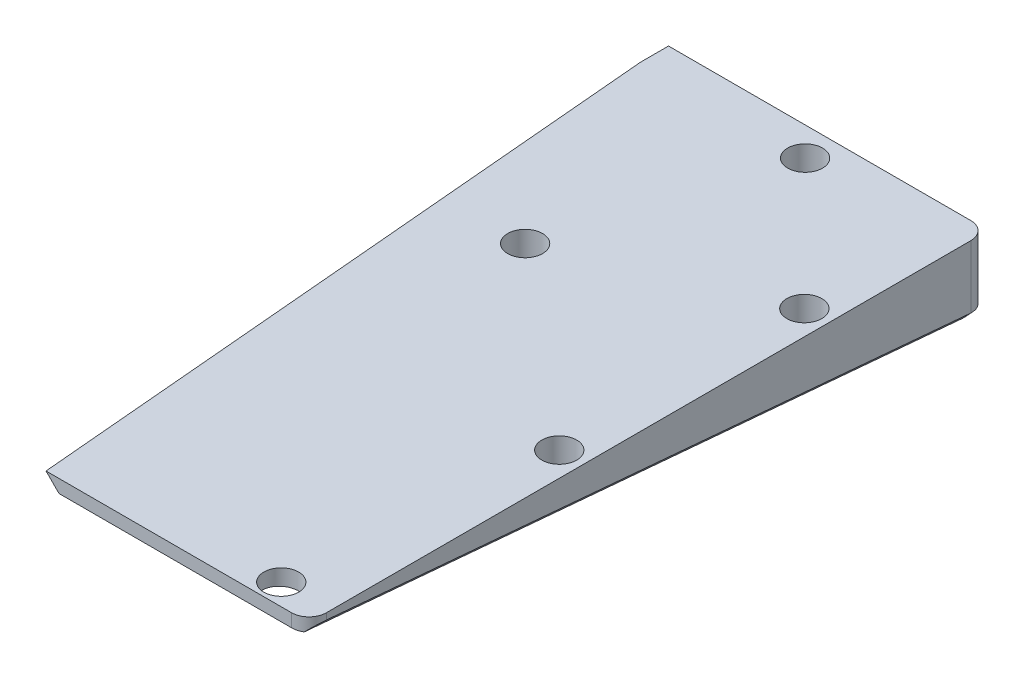
ISO-10303-21;
HEADER;
FILE_DESCRIPTION(('STEP AP214'),'2;1');
FILE_NAME('part.step','',(''),(''),'','','');
FILE_SCHEMA(('AUTOMOTIVE_DESIGN { 1 0 10303 214 1 1 1 1 }'));
ENDSEC;
DATA;
#1=APPLICATION_CONTEXT('core data for automotive mechanical design processes');
#2=APPLICATION_PROTOCOL_DEFINITION('international standard','automotive_design',2000,#1);
#3=PRODUCT_CONTEXT('',#1,'mechanical');
#4=PRODUCT('Part','Part','',(#3));
#5=PRODUCT_RELATED_PRODUCT_CATEGORY('part','',(#4));
#6=PRODUCT_DEFINITION_FORMATION('','',#4);
#7=PRODUCT_DEFINITION_CONTEXT('part definition',#1,'design');
#8=PRODUCT_DEFINITION('design','',#6,#7);
#9=PRODUCT_DEFINITION_SHAPE('','',#8);
#10=(LENGTH_UNIT() NAMED_UNIT(*) SI_UNIT(.MILLI.,.METRE.));
#11=(NAMED_UNIT(*) PLANE_ANGLE_UNIT() SI_UNIT($,.RADIAN.));
#12=(NAMED_UNIT(*) SI_UNIT($,.STERADIAN.) SOLID_ANGLE_UNIT());
#13=UNCERTAINTY_MEASURE_WITH_UNIT(LENGTH_MEASURE(1.E-05),#10,'distance_accuracy_value','');
#14=(GEOMETRIC_REPRESENTATION_CONTEXT(3) GLOBAL_UNCERTAINTY_ASSIGNED_CONTEXT((#13)) GLOBAL_UNIT_ASSIGNED_CONTEXT((#10,
#11,#12)) REPRESENTATION_CONTEXT('',''));
#15=CARTESIAN_POINT('',(0.,0.,0.));
#16=DIRECTION('',(0.,0.,1.));
#17=DIRECTION('',(1.,0.,0.));
#18=AXIS2_PLACEMENT_3D('',#15,#16,#17);
#19=CARTESIAN_POINT('',(0.,-17.7205902201383,1.55035075525034));
#20=DIRECTION('',(0.,-0.996194698091746,0.0871557427476512));
#21=DIRECTION('',(0.,-0.0871557427476512,-0.996194698091746));
#22=AXIS2_PLACEMENT_3D('',#19,#20,#21);
#23=PLANE('',#22);
#24=CARTESIAN_POINT('',(317.358422139956,-26.5355177914709,-99.2047324301417));
#25=DIRECTION('',(0.,-0.996194698091746,0.0871557427476512));
#26=DIRECTION('',(0.,0.0871557427476512,0.996194698091746));
#27=AXIS2_PLACEMENT_3D('',#24,#25,#26);
#28=ELLIPSE('',#27,3.01145951263003,2.99999999999999);
#29=CARTESIAN_POINT('',(317.358422139956,-26.2730518008931,-96.2047324301417));
#30=VERTEX_POINT('',#29);
#31=EDGE_CURVE('E284',#30,#30,#28,.T.);
#32=ORIENTED_EDGE('',*,*,#31,.F.);
#33=EDGE_LOOP('',(#32));
#34=FACE_BOUND('',#33,.T.);
#35=CARTESIAN_POINT('',(339.713934060173,-24.5681448630081,-76.7175569587733));
#36=DIRECTION('',(0.,-0.996194698091746,0.0871557427476512));
#37=DIRECTION('',(0.,0.0871557427476512,0.996194698091746));
#38=AXIS2_PLACEMENT_3D('',#35,#36,#37);
#39=ELLIPSE('',#38,3.01145951263003,2.99999999999999);
#40=CARTESIAN_POINT('',(342.588398945081,-24.4930139699997,-75.8588069221346));
#41=VERTEX_POINT('',#40);
#42=CARTESIAN_POINT('',(342.588398945081,-24.6432757560164,-77.576306995412));
#43=VERTEX_POINT('',#42);
#44=EDGE_CURVE('E59',#41,#43,#39,.T.);
#45=ORIENTED_EDGE('',*,*,#44,.F.);
#46=DIRECTION('',(0.,0.0871557427476512,0.996194698091746));
#47=VECTOR('',#46,1.);
#48=CARTESIAN_POINT('',(342.588398945081,-17.0078716172905,9.69676166295298));
#49=LINE('',#48,#47);
#50=CARTESIAN_POINT('',(342.588398945081,-20.9553185003777,-35.4227626731097));
#51=VERTEX_POINT('',#50);
#52=EDGE_CURVE('E129',#41,#51,#49,.T.);
#53=ORIENTED_EDGE('',*,*,#52,.T.);
#54=CARTESIAN_POINT('',(339.713934060173,-20.8801876073693,-34.564012636471));
#55=DIRECTION('',(0.,-0.996194698091746,0.0871557427476512));
#56=DIRECTION('',(0.,0.0871557427476512,0.996194698091746));
#57=AXIS2_PLACEMENT_3D('',#54,#55,#56);
#58=ELLIPSE('',#57,3.01145951263003,2.99999999999999);
#59=CARTESIAN_POINT('',(342.588398945081,-20.805056714361,-33.7052625998323));
#60=VERTEX_POINT('',#59);
#61=EDGE_CURVE('E53',#60,#51,#58,.T.);
#62=ORIENTED_EDGE('',*,*,#61,.F.);
#63=CARTESIAN_POINT('',(342.588398945081,-16.7900939448977,12.1859718487765));
#64=VERTEX_POINT('',#63);
#65=EDGE_CURVE('E127',#60,#64,#49,.T.);
#66=ORIENTED_EDGE('',*,*,#65,.T.);
#67=CARTESIAN_POINT('',(340.913934060172,-17.0078716172905,9.69676166295297));
#68=DIRECTION('',(0.,-0.996194698091746,0.0871557427476512));
#69=DIRECTION('',(0.,-0.0871557427476512,-0.996194698091746));
#70=AXIS2_PLACEMENT_3D('',#67,#68,#69);
#71=ELLIPSE('',#70,3.01145951263004,3.);
#72=CARTESIAN_POINT('',(340.913934060172,-16.7454056267128,12.696761662953));
#73=VERTEX_POINT('',#72);
#74=EDGE_CURVE('E164',#64,#73,#71,.T.);
#75=ORIENTED_EDGE('',*,*,#74,.T.);
#76=DIRECTION('',(1.,0.,0.));
#77=VECTOR('',#76,1.);
#78=CARTESIAN_POINT('',(288.913934060172,-16.7454056267128,12.6967616629529));
#79=LINE('',#78,#77);
#80=CARTESIAN_POINT('',(300.913934060173,-16.7454056267128,12.6967616629529));
#81=VERTEX_POINT('',#80);
#82=EDGE_CURVE('E300',#81,#73,#79,.T.);
#83=ORIENTED_EDGE('',*,*,#82,.F.);
#84=DIRECTION('',(0.,-0.0871557427476512,-0.996194698091746));
#85=VECTOR('',#84,1.);
#86=CARTESIAN_POINT('',(300.913934060173,-17.7205902201383,1.55035075525034));
#87=LINE('',#86,#85);
#88=CARTESIAN_POINT('',(300.913934060173,-26.8418550294905,-102.70618308299));
#89=VERTEX_POINT('',#88);
#90=EDGE_CURVE('E333',#81,#89,#87,.T.);
#91=ORIENTED_EDGE('',*,*,#90,.T.);
#92=DIRECTION('',(1.,0.,0.));
#93=VECTOR('',#92,1.);
#94=CARTESIAN_POINT('',(340.913934060172,-26.8418550294905,-102.70618308299));
#95=LINE('',#94,#93);
#96=CARTESIAN_POINT('',(340.913934060173,-26.8418550294905,-102.70618308299));
#97=VERTEX_POINT('',#96);
#98=EDGE_CURVE('E136',#89,#97,#95,.T.);
#99=ORIENTED_EDGE('',*,*,#98,.T.);
#100=CARTESIAN_POINT('',(342.588398945081,-26.6953583345888,-101.031718198081));
#101=CARTESIAN_POINT('',(342.588406328742,-26.7049465744389,-101.141312281059));
#102=CARTESIAN_POINT('',(342.577605316831,-26.7145344174403,-101.250901828036));
#103=CARTESIAN_POINT('',(342.534843826856,-26.7333424265026,-101.465878355329));
#104=CARTESIAN_POINT('',(342.502877735184,-26.7425618140536,-101.571256437236));
#105=CARTESIAN_POINT('',(342.418998055313,-26.7602785711942,-101.773759897989));
#106=CARTESIAN_POINT('',(342.367087939197,-26.7687752074231,-101.870876894482));
#107=CARTESIAN_POINT('',(342.245313518486,-26.7847198676008,-102.053125194264));
#108=CARTESIAN_POINT('',(342.175454254578,-26.7921672315422,-102.138248953631));
#109=CARTESIAN_POINT('',(342.020464815723,-26.8057270504082,-102.293238392486));
#110=CARTESIAN_POINT('',(341.935341056356,-26.8118389440424,-102.363097656394));
#111=CARTESIAN_POINT('',(341.753092756573,-26.8224928253622,-102.484872077107));
#112=CARTESIAN_POINT('',(341.655975760083,-26.8270343720445,-102.53678219322));
#113=CARTESIAN_POINT('',(341.453472299325,-26.8343728931336,-102.620661873094));
#114=CARTESIAN_POINT('',(341.348094217424,-26.8371695637719,-102.652627964763));
#115=CARTESIAN_POINT('',(341.133117690124,-26.8409107093803,-102.69538945474));
#116=CARTESIAN_POINT('',(341.023528143151,-26.8418556754771,-102.706190466651));
#117=CARTESIAN_POINT('',(340.913934060173,-26.8418550294905,-102.70618308299));
#118=B_SPLINE_CURVE_WITH_KNOTS('',3,(#100,#101,#102,#103,#104,#105,#106,#107,#108,#109,#110,
#111,#112,#113,#114,#115,#116,#117),.UNSPECIFIED.,.F.,.F.,(4,2,2,2,2,2,2,2,4),(3.14159265358979,
3.33794219443916,3.53429173528852,3.73064127613788,3.92699081698724,4.1233403578366,
4.31968989868597,4.51603943953533,4.71238898038469),.UNSPECIFIED.);
#119=CARTESIAN_POINT('',(342.588398945081,-26.6953583345888,-101.031718198081));
#120=VERTEX_POINT('',#119);
#121=EDGE_CURVE('E140',#97,#120,#118,.F.);
#122=ORIENTED_EDGE('',*,*,#121,.T.);
#123=EDGE_CURVE('E138',#120,#43,#49,.T.);
#124=ORIENTED_EDGE('',*,*,#123,.T.);
#125=EDGE_LOOP('',(#45,#53,#62,#66,#75,#83,#91,#99,#122,#124));
#126=FACE_BOUND('',#125,.T.);
#127=CARTESIAN_POINT('',(335.469137880215,-17.0672587749561,9.01796334472294));
#128=DIRECTION('',(0.,-0.996194698091746,0.0871557427476512));
#129=DIRECTION('',(0.,0.0871557427476512,0.996194698091746));
#130=AXIS2_PLACEMENT_3D('',#127,#128,#129);
#131=ELLIPSE('',#130,3.01145951263003,2.99999999999999);
#132=CARTESIAN_POINT('',(335.469137880215,-16.8047927843783,12.0179633447229));
#133=VERTEX_POINT('',#132);
#134=EDGE_CURVE('E287',#133,#133,#131,.T.);
#135=ORIENTED_EDGE('',*,*,#134,.F.);
#136=EDGE_LOOP('',(#135));
#137=FACE_BOUND('',#136,.T.);
#138=CARTESIAN_POINT('',(306.008403345819,-23.3147147139886,-62.3907847976222));
#139=DIRECTION('',(0.,-0.996194698091746,0.0871557427476512));
#140=DIRECTION('',(0.,0.0871557427476512,0.996194698091746));
#141=AXIS2_PLACEMENT_3D('',#138,#139,#140);
#142=ELLIPSE('',#141,3.01145951263003,2.99999999999999);
#143=CARTESIAN_POINT('',(306.008403345819,-23.0522487234109,-59.3907847976222));
#144=VERTEX_POINT('',#143);
#145=EDGE_CURVE('E292',#144,#144,#142,.T.);
#146=ORIENTED_EDGE('',*,*,#145,.F.);
#147=EDGE_LOOP('',(#146));
#148=FACE_BOUND('',#147,.T.);
#149=ADVANCED_FACE('F37',(#34,#126,#137,#148),#23,.T.);
#150=CARTESIAN_POINT('',(0.,-14.5,0.));
#151=DIRECTION('',(0.,-1.,0.));
#152=DIRECTION('',(0.,0.,-1.));
#153=AXIS2_PLACEMENT_3D('',#150,#151,#152);
#154=PLANE('',#153);
#155=CARTESIAN_POINT('',(317.358422139956,-14.5,-99.2047324301417));
#156=DIRECTION('',(0.,1.,0.));
#157=DIRECTION('',(0.,0.,1.));
#158=AXIS2_PLACEMENT_3D('',#155,#156,#157);
#159=CIRCLE('',#158,2.99999999999999);
#160=CARTESIAN_POINT('',(317.358422139956,-14.5,-96.2047324301417));
#161=VERTEX_POINT('',#160);
#162=EDGE_CURVE('E130',#161,#161,#159,.T.);
#163=ORIENTED_EDGE('',*,*,#162,.F.);
#164=EDGE_LOOP('',(#163));
#165=FACE_BOUND('',#164,.T.);
#166=CARTESIAN_POINT('',(339.713934060173,-14.5,-76.7175569587733));
#167=DIRECTION('',(0.,1.,0.));
#168=DIRECTION('',(0.,0.,1.));
#169=AXIS2_PLACEMENT_3D('',#166,#167,#168);
#170=CIRCLE('',#169,2.99999999999999);
#171=CARTESIAN_POINT('',(339.713934060173,-14.5,-73.7175569587733));
#172=VERTEX_POINT('',#171);
#173=EDGE_CURVE('E387',#172,#172,#170,.T.);
#174=ORIENTED_EDGE('',*,*,#173,.F.);
#175=EDGE_LOOP('',(#174));
#176=FACE_BOUND('',#175,.T.);
#177=CARTESIAN_POINT('',(339.713934060173,-14.5,-34.564012636471));
#178=DIRECTION('',(0.,1.,0.));
#179=DIRECTION('',(0.,0.,1.));
#180=AXIS2_PLACEMENT_3D('',#177,#178,#179);
#181=CIRCLE('',#180,2.99999999999999);
#182=CARTESIAN_POINT('',(339.713934060173,-14.5,-31.564012636471));
#183=VERTEX_POINT('',#182);
#184=EDGE_CURVE('E390',#183,#183,#181,.T.);
#185=ORIENTED_EDGE('',*,*,#184,.F.);
#186=EDGE_LOOP('',(#185));
#187=FACE_BOUND('',#186,.T.);
#188=CARTESIAN_POINT('',(335.469137880215,-14.5,9.01796334472294));
#189=DIRECTION('',(0.,1.,0.));
#190=DIRECTION('',(0.,0.,1.));
#191=AXIS2_PLACEMENT_3D('',#188,#189,#190);
#192=CIRCLE('',#191,2.99999999999999);
#193=CARTESIAN_POINT('',(335.469137880215,-14.5,12.0179633447229));
#194=VERTEX_POINT('',#193);
#195=EDGE_CURVE('E395',#194,#194,#192,.T.);
#196=ORIENTED_EDGE('',*,*,#195,.F.);
#197=EDGE_LOOP('',(#196));
#198=FACE_BOUND('',#197,.T.);
#199=CARTESIAN_POINT('',(306.008403345819,-14.5,-62.3907847976222));
#200=DIRECTION('',(0.,1.,0.));
#201=DIRECTION('',(0.,0.,1.));
#202=AXIS2_PLACEMENT_3D('',#199,#200,#201);
#203=CIRCLE('',#202,2.99999999999999);
#204=CARTESIAN_POINT('',(306.008403345819,-14.5,-59.3907847976222));
#205=VERTEX_POINT('',#204);
#206=EDGE_CURVE('E398',#205,#205,#203,.T.);
#207=ORIENTED_EDGE('',*,*,#206,.F.);
#208=EDGE_LOOP('',(#207));
#209=FACE_BOUND('',#208,.T.);
#210=DIRECTION('',(0.,0.,1.));
#211=VECTOR('',#210,1.);
#212=CARTESIAN_POINT('',(288.913934060172,-14.5,-104.155083501279));
#213=LINE('',#212,#211);
#214=CARTESIAN_POINT('',(288.913934060172,-14.5,-104.155083501279));
#215=VERTEX_POINT('',#214);
#216=CARTESIAN_POINT('',(288.913934060172,-14.5,-99.3226935308554));
#217=VERTEX_POINT('',#216);
#218=EDGE_CURVE('E285',#215,#217,#213,.T.);
#219=ORIENTED_EDGE('',*,*,#218,.T.);
#220=DIRECTION('',(-0.0868265938642397,0.,-0.996223440096615));
#221=VECTOR('',#220,1.);
#222=CARTESIAN_POINT('',(287.472081219976,-14.5,-115.866099561721));
#223=LINE('',#222,#221);
#224=CARTESIAN_POINT('',(298.677072879776,-14.5,12.6967616629529));
#225=VERTEX_POINT('',#224);
#226=EDGE_CURVE('E334',#217,#225,#223,.F.);
#227=ORIENTED_EDGE('',*,*,#226,.T.);
#228=DIRECTION('',(1.,0.,0.));
#229=VECTOR('',#228,1.);
#230=CARTESIAN_POINT('',(288.913934060172,-14.5,12.6967616629529));
#231=LINE('',#230,#229);
#232=CARTESIAN_POINT('',(340.913934060172,-14.5,12.696761662953));
#233=VERTEX_POINT('',#232);
#234=EDGE_CURVE('E298',#225,#233,#231,.T.);
#235=ORIENTED_EDGE('',*,*,#234,.T.);
#236=CARTESIAN_POINT('',(340.913934060172,-14.5,9.69676166295297));
#237=DIRECTION('',(0.,-1.,0.));
#238=DIRECTION('',(0.,0.,-1.));
#239=AXIS2_PLACEMENT_3D('',#236,#237,#238);
#240=CIRCLE('',#239,3.);
#241=CARTESIAN_POINT('',(343.913934060172,-14.5,9.69676166295297));
#242=VERTEX_POINT('',#241);
#243=EDGE_CURVE('E156',#233,#242,#240,.F.);
#244=ORIENTED_EDGE('',*,*,#243,.T.);
#245=DIRECTION('',(0.,0.,1.));
#246=VECTOR('',#245,1.);
#247=CARTESIAN_POINT('',(343.913934060172,-14.5,-104.155083501279));
#248=LINE('',#247,#246);
#249=CARTESIAN_POINT('',(343.913934060172,-14.5,-101.155083501279));
#250=VERTEX_POINT('',#249);
#251=EDGE_CURVE('E301',#250,#242,#248,.T.);
#252=ORIENTED_EDGE('',*,*,#251,.F.);
#253=CARTESIAN_POINT('',(340.913934060172,-14.5,-101.155083501279));
#254=DIRECTION('',(0.,-1.,0.));
#255=DIRECTION('',(0.,0.,-1.));
#256=AXIS2_PLACEMENT_3D('',#253,#254,#255);
#257=CIRCLE('',#256,3.);
#258=CARTESIAN_POINT('',(340.913934060172,-14.5,-104.155083501279));
#259=VERTEX_POINT('',#258);
#260=EDGE_CURVE('E313',#250,#259,#257,.F.);
#261=ORIENTED_EDGE('',*,*,#260,.T.);
#262=DIRECTION('',(1.,0.,0.));
#263=VECTOR('',#262,1.);
#264=CARTESIAN_POINT('',(288.913934060172,-14.5,-104.155083501279));
#265=LINE('',#264,#263);
#266=EDGE_CURVE('E305',#215,#259,#265,.T.);
#267=ORIENTED_EDGE('',*,*,#266,.F.);
#268=EDGE_LOOP('',(#219,#227,#235,#244,#252,#261,#267));
#269=FACE_BOUND('',#268,.T.);
#270=ADVANCED_FACE('F319',(#165,#176,#187,#198,#209,#269),#154,.F.);
#271=CARTESIAN_POINT('',(288.913934060172,-151.252247056961,-104.155083501279));
#272=DIRECTION('',(-1.,0.,0.));
#273=DIRECTION('',(0.,0.,1.));
#274=AXIS2_PLACEMENT_3D('',#271,#272,#273);
#275=PLANE('',#274);
#276=DIRECTION('',(0.,1.,0.));
#277=VECTOR('',#276,1.);
#278=CARTESIAN_POINT('',(288.913934060172,-151.252247056961,-104.155083501279));
#279=LINE('',#278,#277);
#280=CARTESIAN_POINT('',(288.913934060172,-14.9227793401484,-104.155083501279));
#281=VERTEX_POINT('',#280);
#282=EDGE_CURVE('E304',#281,#215,#279,.T.);
#283=ORIENTED_EDGE('',*,*,#282,.F.);
#284=DIRECTION('',(0.,0.0871557427476512,0.996194698091746));
#285=VECTOR('',#284,1.);
#286=CARTESIAN_POINT('',(288.913934060172,-15.9583548127822,-115.991765316942));
#287=LINE('',#286,#285);
#288=EDGE_CURVE('E169',#281,#217,#287,.T.);
#289=ORIENTED_EDGE('',*,*,#288,.T.);
#290=ORIENTED_EDGE('',*,*,#218,.F.);
#291=EDGE_LOOP('',(#283,#289,#290));
#292=FACE_BOUND('',#291,.T.);
#293=ADVANCED_FACE('F352',(#292),#275,.T.);
#294=CARTESIAN_POINT('',(288.913934060172,-151.252247056961,12.6967616629529));
#295=DIRECTION('',(0.,0.,1.));
#296=DIRECTION('',(1.,0.,0.));
#297=AXIS2_PLACEMENT_3D('',#294,#295,#296);
#298=PLANE('',#297);
#299=ORIENTED_EDGE('',*,*,#234,.F.);
#300=DIRECTION('',(-0.705757556807948,0.708453436019952,0.));
#301=VECTOR('',#300,1.);
#302=CARTESIAN_POINT('',(362.18974124536,-78.2552764406855,12.696761662953));
#303=LINE('',#302,#301);
#304=EDGE_CURVE('E332',#225,#81,#303,.F.);
#305=ORIENTED_EDGE('',*,*,#304,.T.);
#306=ORIENTED_EDGE('',*,*,#82,.T.);
#307=DIRECTION('',(0.,1.,0.));
#308=VECTOR('',#307,1.);
#309=CARTESIAN_POINT('',(340.913934060172,-14.5,12.696761662953));
#310=LINE('',#309,#308);
#311=EDGE_CURVE('E308',#73,#233,#310,.T.);
#312=ORIENTED_EDGE('',*,*,#311,.T.);
#313=EDGE_LOOP('',(#299,#305,#306,#312));
#314=FACE_BOUND('',#313,.T.);
#315=ADVANCED_FACE('F330',(#314),#298,.T.);
#316=CARTESIAN_POINT('',(343.913934060172,-151.252247056961,-104.155083501279));
#317=DIRECTION('',(-1.,0.,0.));
#318=DIRECTION('',(0.,0.,1.));
#319=AXIS2_PLACEMENT_3D('',#316,#317,#318);
#320=PLANE('',#319);
#321=DIRECTION('',(0.,1.,0.));
#322=VECTOR('',#321,1.);
#323=CARTESIAN_POINT('',(343.913934060172,-16.7454056267128,9.69676166295297));
#324=LINE('',#323,#322);
#325=CARTESIAN_POINT('',(343.913934060172,-15.5870066838904,9.69676166295297));
#326=VERTEX_POINT('',#325);
#327=EDGE_CURVE('E155',#242,#326,#324,.F.);
#328=ORIENTED_EDGE('',*,*,#327,.T.);
#329=DIRECTION('',(0.,-0.0871557427476512,-0.996194698091746));
#330=VECTOR('',#329,1.);
#331=CARTESIAN_POINT('',(343.913934060172,-25.2960795321932,-101.278448804477));
#332=LINE('',#331,#330);
#333=CARTESIAN_POINT('',(343.913934060172,-25.2852864666909,-101.155083501279));
#334=VERTEX_POINT('',#333);
#335=EDGE_CURVE('E151',#326,#334,#332,.T.);
#336=ORIENTED_EDGE('',*,*,#335,.T.);
#337=DIRECTION('',(0.,1.,0.));
#338=VECTOR('',#337,1.);
#339=CARTESIAN_POINT('',(343.913934060172,-151.252247056961,-101.155083501279));
#340=LINE('',#339,#338);
#341=EDGE_CURVE('E152',#334,#250,#340,.T.);
#342=ORIENTED_EDGE('',*,*,#341,.T.);
#343=ORIENTED_EDGE('',*,*,#251,.T.);
#344=EDGE_LOOP('',(#328,#336,#342,#343));
#345=FACE_BOUND('',#344,.T.);
#346=ADVANCED_FACE('F325',(#345),#320,.F.);
#347=CARTESIAN_POINT('',(288.913934060172,-151.252247056961,-104.155083501279));
#348=DIRECTION('',(0.,0.,1.));
#349=DIRECTION('',(1.,0.,0.));
#350=AXIS2_PLACEMENT_3D('',#347,#348,#349);
#351=PLANE('',#350);
#352=DIRECTION('',(0.,1.,0.));
#353=VECTOR('',#352,1.);
#354=CARTESIAN_POINT('',(340.913934060172,-151.252247056961,-104.155083501279));
#355=LINE('',#354,#353);
#356=CARTESIAN_POINT('',(340.913934060172,-25.4317831615908,-104.155083501279));
#357=VERTEX_POINT('',#356);
#358=EDGE_CURVE('E166',#259,#357,#355,.F.);
#359=ORIENTED_EDGE('',*,*,#358,.T.);
#360=DIRECTION('',(-1.,0.,0.));
#361=VECTOR('',#360,1.);
#362=CARTESIAN_POINT('',(300.913934060173,-25.4317831615926,-104.155083501279));
#363=LINE('',#362,#361);
#364=CARTESIAN_POINT('',(299.382947949321,-25.4317831615926,-104.155083501279));
#365=VERTEX_POINT('',#364);
#366=EDGE_CURVE('E175',#357,#365,#363,.T.);
#367=ORIENTED_EDGE('',*,*,#366,.T.);
#368=DIRECTION('',(0.705757556807948,-0.708453436019952,0.));
#369=VECTOR('',#368,1.);
#370=CARTESIAN_POINT('',(289.43171803333,-15.4425411639659,-104.155083501279));
#371=LINE('',#370,#369);
#372=EDGE_CURVE('E336',#365,#281,#371,.F.);
#373=ORIENTED_EDGE('',*,*,#372,.T.);
#374=ORIENTED_EDGE('',*,*,#282,.T.);
#375=ORIENTED_EDGE('',*,*,#266,.T.);
#376=EDGE_LOOP('',(#359,#367,#373,#374,#375));
#377=FACE_BOUND('',#376,.T.);
#378=ADVANCED_FACE('F360',(#377),#351,.F.);
#379=CARTESIAN_POINT('',(340.913934060172,-151.252247056961,9.69676166295297));
#380=DIRECTION('',(0.,-1.,0.));
#381=DIRECTION('',(0.,0.,-1.));
#382=AXIS2_PLACEMENT_3D('',#379,#380,#381);
#383=CYLINDRICAL_SURFACE('',#382,3.);
#384=ORIENTED_EDGE('',*,*,#74,.F.);
#385=CARTESIAN_POINT('',(340.913934060172,-18.802760647456,9.69676166295297));
#386=DIRECTION('',(0.729911946088875,-0.680940103962023,0.0595745396368363));
#387=DIRECTION('',(-0.678683288080086,-0.732339111898436,-0.0553933178696906));
#388=AXIS2_PLACEMENT_3D('',#385,#386,#387);
#389=ELLIPSE('',#388,4.40567383613422,3.);
#390=EDGE_CURVE('E134',#64,#326,#389,.F.);
#391=ORIENTED_EDGE('',*,*,#390,.T.);
#392=ORIENTED_EDGE('',*,*,#327,.F.);
#393=ORIENTED_EDGE('',*,*,#243,.F.);
#394=ORIENTED_EDGE('',*,*,#311,.F.);
#395=EDGE_LOOP('',(#384,#391,#392,#393,#394));
#396=FACE_BOUND('',#395,.T.);
#397=ADVANCED_FACE('F203',(#396),#383,.T.);
#398=CARTESIAN_POINT('',(340.913934060172,-151.252247056961,-101.155083501279));
#399=DIRECTION('',(0.,1.,0.));
#400=DIRECTION('',(0.,0.,1.));
#401=AXIS2_PLACEMENT_3D('',#398,#399,#400);
#402=CYLINDRICAL_SURFACE('',#401,3.);
#403=ORIENTED_EDGE('',*,*,#341,.F.);
#404=CARTESIAN_POINT('',(340.913934060172,-25.4317831615926,-104.155083501279));
#405=CARTESIAN_POINT('',(341.110284698455,-25.4317838075793,-104.155096729973));
#406=CARTESIAN_POINT('',(341.306627209957,-25.4308388414824,-104.135745451826));
#407=CARTESIAN_POINT('',(341.691782842485,-25.427097695874,-104.059133233151));
#408=CARTESIAN_POINT('',(341.88058002095,-25.4243010252357,-104.001862235189));
#409=CARTESIAN_POINT('',(342.243388693585,-25.4169625041466,-103.851581962437));
#410=CARTESIAN_POINT('',(342.417385169772,-25.4124209574643,-103.758578908299));
#411=CARTESIAN_POINT('',(342.743904348691,-25.4017670761446,-103.540405768074));
#412=CARTESIAN_POINT('',(342.896413535597,-25.3956551825104,-103.415244712974));
#413=CARTESIAN_POINT('',(343.174095271867,-25.3820953636443,-103.137562976703));
#414=CARTESIAN_POINT('',(343.299256326968,-25.374647999703,-102.985053789796));
#415=CARTESIAN_POINT('',(343.517429467192,-25.3587033395251,-102.658534610879));
#416=CARTESIAN_POINT('',(343.610432521331,-25.3502067032964,-102.48453813469));
#417=CARTESIAN_POINT('',(343.760712794082,-25.3324899461556,-102.121729462058));
#418=CARTESIAN_POINT('',(343.817983792045,-25.3232705586048,-101.932932283589));
#419=CARTESIAN_POINT('',(343.89459601072,-25.3044625495423,-101.547776651065));
#420=CARTESIAN_POINT('',(343.913947288866,-25.294874706541,-101.351434139562));
#421=CARTESIAN_POINT('',(343.913934060172,-25.2852864666909,-101.155083501279));
#422=B_SPLINE_CURVE_WITH_KNOTS('',3,(#404,#405,#406,#407,#408,#409,#410,#411,#412,#413,#414,
#415,#416,#417,#418,#419,#420,#421),.UNSPECIFIED.,.F.,.F.,(4,2,2,2,2,2,2,2,4),(3.14159265358979,
3.33794219443916,3.53429173528852,3.73064127613788,3.92699081698724,4.1233403578366,
4.31968989868597,4.51603943953533,4.71238898038469),.UNSPECIFIED.);
#423=EDGE_CURVE('E124',#334,#357,#422,.F.);
#424=ORIENTED_EDGE('',*,*,#423,.T.);
#425=ORIENTED_EDGE('',*,*,#358,.F.);
#426=ORIENTED_EDGE('',*,*,#260,.F.);
#427=EDGE_LOOP('',(#403,#424,#425,#426));
#428=FACE_BOUND('',#427,.T.);
#429=ADVANCED_FACE('F192',(#428),#402,.T.);
#430=CARTESIAN_POINT('',(288.913934060172,-15.9583548127822,-115.991765316942));
#431=DIRECTION('',(0.707106781186551,0.704416026402755,-0.0616284167162141));
#432=DIRECTION('',(0.,0.0871557427476512,0.996194698091746));
#433=AXIS2_PLACEMENT_3D('',#430,#431,#432);
#434=PLANE('',#433);
#435=ORIENTED_EDGE('',*,*,#372,.F.);
#436=DIRECTION('',(-0.603689998028265,0.556011760732112,-0.571322420536959));
#437=VECTOR('',#436,1.);
#438=CARTESIAN_POINT('',(288.305273759412,-15.2290016822484,-114.638814642709));
#439=LINE('',#438,#437);
#440=EDGE_CURVE('E177',#365,#89,#439,.F.);
#441=ORIENTED_EDGE('',*,*,#440,.T.);
#442=ORIENTED_EDGE('',*,*,#90,.F.);
#443=ORIENTED_EDGE('',*,*,#304,.F.);
#444=ORIENTED_EDGE('',*,*,#226,.F.);
#445=ORIENTED_EDGE('',*,*,#288,.F.);
#446=EDGE_LOOP('',(#435,#441,#442,#443,#444,#445));
#447=FACE_BOUND('',#446,.T.);
#448=ADVANCED_FACE('F202',(#447),#434,.F.);
#449=CARTESIAN_POINT('',(0.,-26.8418550294905,-102.70618308299));
#450=DIRECTION('',(0.,-0.716644118025435,-0.697439035399902));
#451=DIRECTION('',(-1.,0.,0.));
#452=AXIS2_PLACEMENT_3D('',#449,#450,#451);
#453=PLANE('',#452);
#454=ORIENTED_EDGE('',*,*,#440,.F.);
#455=ORIENTED_EDGE('',*,*,#366,.F.);
#456=CARTESIAN_POINT('',(340.913934060173,-26.8418550294905,-102.70618308299));
#457=CARTESIAN_POINT('',(340.913934060172,-25.4317831615926,-104.155083501279));
#458=B_SPLINE_CURVE_WITH_KNOTS('',1,(#456,#457),.UNSPECIFIED.,.F.,.F.,(2,2),(0.,1.),.UNSPECIFIED.);
#459=EDGE_CURVE('E255',#97,#357,#458,.T.);
#460=ORIENTED_EDGE('',*,*,#459,.F.);
#461=ORIENTED_EDGE('',*,*,#98,.F.);
#462=EDGE_LOOP('',(#454,#455,#460,#461));
#463=FACE_BOUND('',#462,.T.);
#464=ADVANCED_FACE('F40',(#463),#453,.T.);
#465=CARTESIAN_POINT('',(340.913934060173,-26.8418550294905,-102.70618308299));
#466=CARTESIAN_POINT('',(341.023528143151,-26.8418556754771,-102.706190466651));
#467=CARTESIAN_POINT('',(341.133117690124,-26.8409107093803,-102.69538945474));
#468=CARTESIAN_POINT('',(341.348094217424,-26.8371695637719,-102.652627964763));
#469=CARTESIAN_POINT('',(341.453472299325,-26.8343728931336,-102.620661873094));
#470=CARTESIAN_POINT('',(341.655975760083,-26.8270343720445,-102.53678219322));
#471=CARTESIAN_POINT('',(341.753092756573,-26.8224928253622,-102.484872077107));
#472=CARTESIAN_POINT('',(341.935341056356,-26.8118389440424,-102.363097656394));
#473=CARTESIAN_POINT('',(342.020464815723,-26.8057270504082,-102.293238392486));
#474=CARTESIAN_POINT('',(342.175454254578,-26.7921672315422,-102.138248953631));
#475=CARTESIAN_POINT('',(342.245313518486,-26.7847198676008,-102.053125194264));
#476=CARTESIAN_POINT('',(342.367087939197,-26.7687752074231,-101.870876894482));
#477=CARTESIAN_POINT('',(342.418998055313,-26.7602785711942,-101.773759897989));
#478=CARTESIAN_POINT('',(342.502877735184,-26.7425618140536,-101.571256437236));
#479=CARTESIAN_POINT('',(342.534843826856,-26.7333424265026,-101.465878355329));
#480=CARTESIAN_POINT('',(342.577605316831,-26.7145344174403,-101.250901828036));
#481=CARTESIAN_POINT('',(342.588406328742,-26.7049465744389,-101.141312281059));
#482=CARTESIAN_POINT('',(342.588398945081,-26.6953583345888,-101.031718198081));
#483=CARTESIAN_POINT('',(340.913934060172,-25.4317831615926,-104.155083501279));
#484=CARTESIAN_POINT('',(341.110284698455,-25.4317838075793,-104.155096729973));
#485=CARTESIAN_POINT('',(341.306627209957,-25.4308388414824,-104.135745451826));
#486=CARTESIAN_POINT('',(341.691782842485,-25.427097695874,-104.059133233151));
#487=CARTESIAN_POINT('',(341.88058002095,-25.4243010252357,-104.001862235189));
#488=CARTESIAN_POINT('',(342.243388693585,-25.4169625041466,-103.851581962437));
#489=CARTESIAN_POINT('',(342.417385169772,-25.4124209574643,-103.758578908299));
#490=CARTESIAN_POINT('',(342.743904348691,-25.4017670761446,-103.540405768074));
#491=CARTESIAN_POINT('',(342.896413535597,-25.3956551825104,-103.415244712974));
#492=CARTESIAN_POINT('',(343.174095271867,-25.3820953636443,-103.137562976703));
#493=CARTESIAN_POINT('',(343.299256326968,-25.374647999703,-102.985053789796));
#494=CARTESIAN_POINT('',(343.517429467192,-25.3587033395251,-102.658534610879));
#495=CARTESIAN_POINT('',(343.610432521331,-25.3502067032964,-102.48453813469));
#496=CARTESIAN_POINT('',(343.760712794082,-25.3324899461556,-102.121729462058));
#497=CARTESIAN_POINT('',(343.817983792045,-25.3232705586048,-101.932932283589));
#498=CARTESIAN_POINT('',(343.89459601072,-25.3044625495423,-101.547776651065));
#499=CARTESIAN_POINT('',(343.913947288866,-25.294874706541,-101.351434139562));
#500=CARTESIAN_POINT('',(343.913934060172,-25.2852864666909,-101.155083501279));
#501=B_SPLINE_SURFACE_WITH_KNOTS('',1,3,((#465,#466,#467,#468,#469,#470,#471,#472,#473,#474,
#475,#476,#477,#478,#479,#480,#481,#482),(#483,#484,#485,#486,#487,#488,#489,#490,#491,#492,
#493,#494,#495,#496,#497,#498,#499,#500)),.UNSPECIFIED.,.F.,.F.,.F.,(2,2),(4,2,2,2,2,2,2,2,4),
(0.,1.),(3.14159265358979,3.33794219443916,3.53429173528852,3.73064127613788,3.92699081698724,
4.1233403578366,4.31968989868597,4.51603943953533,4.71238898038469),.UNSPECIFIED.);
#502=CARTESIAN_POINT('',(343.913934060172,-25.2852864666909,-101.155083501279));
#503=CARTESIAN_POINT('',(342.588398945081,-26.6953583345888,-101.031718198081));
#504=B_SPLINE_CURVE_WITH_KNOTS('',1,(#502,#503),.UNSPECIFIED.,.F.,.F.,(2,2),(0.,1.),.UNSPECIFIED.);
#505=EDGE_CURVE('E233',#120,#334,#504,.F.);
#506=ORIENTED_EDGE('',*,*,#459,.T.);
#507=ORIENTED_EDGE('',*,*,#423,.F.);
#508=ORIENTED_EDGE('',*,*,#505,.F.);
#509=ORIENTED_EDGE('',*,*,#121,.F.);
#510=EDGE_LOOP('',(#506,#507,#508,#509));
#511=FACE_BOUND('',#510,.T.);
#512=ADVANCED_FACE('F217',(#511),#501,.T.);
#513=CARTESIAN_POINT('',(342.588398945081,-17.7205902201383,1.55035075525034));
#514=DIRECTION('',(0.729911946088875,-0.680940103962023,0.0595745396368363));
#515=DIRECTION('',(0.,-0.0871557427476512,-0.996194698091746));
#516=AXIS2_PLACEMENT_3D('',#513,#514,#515);
#517=PLANE('',#516);
#518=CARTESIAN_POINT('',(339.713934060173,-27.6493354785998,-76.7175569587733));
#519=DIRECTION('',(0.729911946088875,-0.680940103962023,0.0595745396368363));
#520=DIRECTION('',(0.678683288080086,0.732339111898436,0.0553933178696906));
#521=AXIS2_PLACEMENT_3D('',#518,#519,#520);
#522=ELLIPSE('',#521,4.40567383613421,2.99999999999999);
#523=EDGE_CURVE('E12',#43,#41,#522,.T.);
#524=ORIENTED_EDGE('',*,*,#523,.F.);
#525=ORIENTED_EDGE('',*,*,#123,.F.);
#526=ORIENTED_EDGE('',*,*,#505,.T.);
#527=ORIENTED_EDGE('',*,*,#335,.F.);
#528=ORIENTED_EDGE('',*,*,#390,.F.);
#529=ORIENTED_EDGE('',*,*,#65,.F.);
#530=CARTESIAN_POINT('',(339.713934060173,-23.961378222961,-34.564012636471));
#531=DIRECTION('',(0.729911946088875,-0.680940103962023,0.0595745396368363));
#532=DIRECTION('',(0.678683288080086,0.732339111898436,0.0553933178696906));
#533=AXIS2_PLACEMENT_3D('',#530,#531,#532);
#534=ELLIPSE('',#533,4.40567383613421,2.99999999999999);
#535=EDGE_CURVE('E47',#51,#60,#534,.T.);
#536=ORIENTED_EDGE('',*,*,#535,.F.);
#537=ORIENTED_EDGE('',*,*,#52,.F.);
#538=EDGE_LOOP('',(#524,#525,#526,#527,#528,#529,#536,#537));
#539=FACE_BOUND('',#538,.T.);
#540=ADVANCED_FACE('F132',(#539),#517,.T.);
#541=CARTESIAN_POINT('',(339.713934060173,-26.8425182821186,-34.564012636471));
#542=DIRECTION('',(0.,1.,0.));
#543=DIRECTION('',(0.,0.,1.));
#544=AXIS2_PLACEMENT_3D('',#541,#542,#543);
#545=CYLINDRICAL_SURFACE('',#544,2.99999999999999);
#546=ORIENTED_EDGE('',*,*,#61,.T.);
#547=ORIENTED_EDGE('',*,*,#535,.T.);
#548=EDGE_LOOP('',(#546,#547));
#549=FACE_BOUND('',#548,.T.);
#550=ORIENTED_EDGE('',*,*,#184,.T.);
#551=EDGE_LOOP('',(#550));
#552=FACE_BOUND('',#551,.T.);
#553=ADVANCED_FACE('F118',(#549,#552),#545,.F.);
#554=CARTESIAN_POINT('',(339.713934060173,-26.8425182821186,-76.7175569587733));
#555=DIRECTION('',(0.,1.,0.));
#556=DIRECTION('',(0.,0.,1.));
#557=AXIS2_PLACEMENT_3D('',#554,#555,#556);
#558=CYLINDRICAL_SURFACE('',#557,2.99999999999999);
#559=ORIENTED_EDGE('',*,*,#44,.T.);
#560=ORIENTED_EDGE('',*,*,#523,.T.);
#561=EDGE_LOOP('',(#559,#560));
#562=FACE_BOUND('',#561,.T.);
#563=ORIENTED_EDGE('',*,*,#173,.T.);
#564=EDGE_LOOP('',(#563));
#565=FACE_BOUND('',#564,.T.);
#566=ADVANCED_FACE('F371',(#562,#565),#558,.F.);
#567=CARTESIAN_POINT('',(306.008403345819,-26.8425182821186,-62.3907847976222));
#568=DIRECTION('',(0.,1.,0.));
#569=DIRECTION('',(0.,0.,1.));
#570=AXIS2_PLACEMENT_3D('',#567,#568,#569);
#571=CYLINDRICAL_SURFACE('',#570,2.99999999999999);
#572=ORIENTED_EDGE('',*,*,#145,.T.);
#573=EDGE_LOOP('',(#572));
#574=FACE_BOUND('',#573,.T.);
#575=ORIENTED_EDGE('',*,*,#206,.T.);
#576=EDGE_LOOP('',(#575));
#577=FACE_BOUND('',#576,.T.);
#578=ADVANCED_FACE('F367',(#574,#577),#571,.F.);
#579=CARTESIAN_POINT('',(335.469137880215,-26.8425182821186,9.01796334472294));
#580=DIRECTION('',(0.,1.,0.));
#581=DIRECTION('',(0.,0.,1.));
#582=AXIS2_PLACEMENT_3D('',#579,#580,#581);
#583=CYLINDRICAL_SURFACE('',#582,2.99999999999999);
#584=ORIENTED_EDGE('',*,*,#134,.T.);
#585=EDGE_LOOP('',(#584));
#586=FACE_BOUND('',#585,.T.);
#587=ORIENTED_EDGE('',*,*,#195,.T.);
#588=EDGE_LOOP('',(#587));
#589=FACE_BOUND('',#588,.T.);
#590=ADVANCED_FACE('F370',(#586,#589),#583,.F.);
#591=CARTESIAN_POINT('',(317.358422139956,-26.8425182821186,-99.2047324301417));
#592=DIRECTION('',(0.,1.,0.));
#593=DIRECTION('',(0.,0.,1.));
#594=AXIS2_PLACEMENT_3D('',#591,#592,#593);
#595=CYLINDRICAL_SURFACE('',#594,2.99999999999999);
#596=ORIENTED_EDGE('',*,*,#31,.T.);
#597=EDGE_LOOP('',(#596));
#598=FACE_BOUND('',#597,.T.);
#599=ORIENTED_EDGE('',*,*,#162,.T.);
#600=EDGE_LOOP('',(#599));
#601=FACE_BOUND('',#600,.T.);
#602=ADVANCED_FACE('F375',(#598,#601),#595,.F.);
#603=CLOSED_SHELL('',(#149,#270,#293,#315,#346,#378,#397,#429,#448,#464,#512,#540,#553,#566,
#578,#590,#602));
#604=MANIFOLD_SOLID_BREP('B2',#603);
#605=ADVANCED_BREP_SHAPE_REPRESENTATION('',(#18,#604),#14);
#606=SHAPE_DEFINITION_REPRESENTATION(#9,#605);
ENDSEC;
END-ISO-10303-21;
